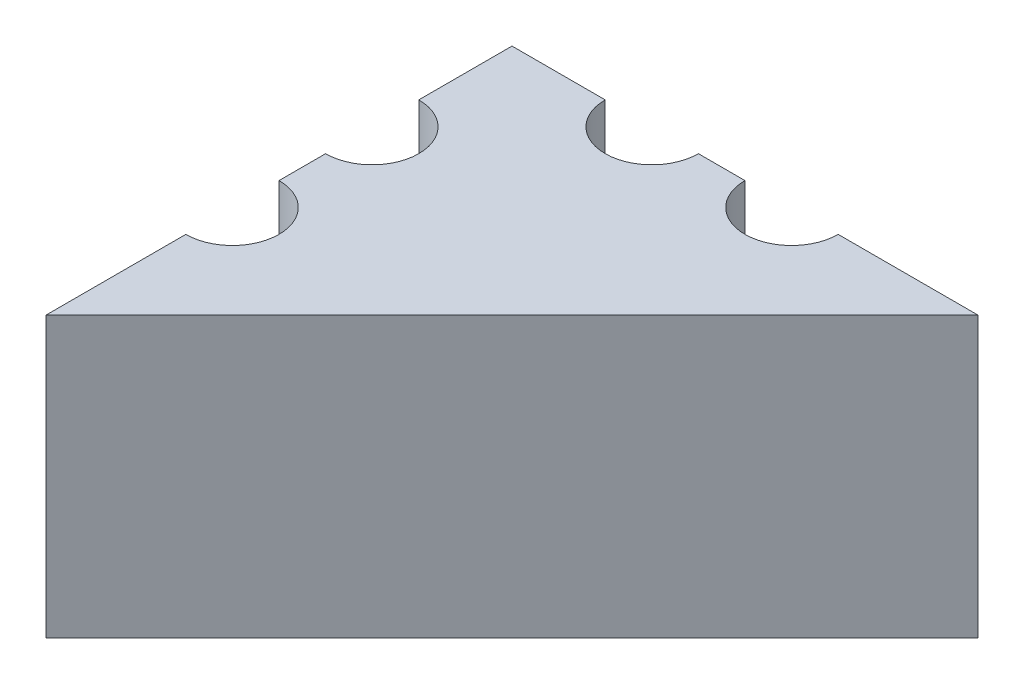
ISO-10303-21;
HEADER;
FILE_DESCRIPTION(('STEP AP214'),'2;1');
FILE_NAME('part.step','',(''),(''),'','','');
FILE_SCHEMA(('AUTOMOTIVE_DESIGN { 1 0 10303 214 1 1 1 1 }'));
ENDSEC;
DATA;
#1=APPLICATION_CONTEXT('core data for automotive mechanical design processes');
#2=APPLICATION_PROTOCOL_DEFINITION('international standard','automotive_design',2000,#1);
#3=PRODUCT_CONTEXT('',#1,'mechanical');
#4=PRODUCT('Part','Part','',(#3));
#5=PRODUCT_RELATED_PRODUCT_CATEGORY('part','',(#4));
#6=PRODUCT_DEFINITION_FORMATION('','',#4);
#7=PRODUCT_DEFINITION_CONTEXT('part definition',#1,'design');
#8=PRODUCT_DEFINITION('design','',#6,#7);
#9=PRODUCT_DEFINITION_SHAPE('','',#8);
#10=(LENGTH_UNIT() NAMED_UNIT(*) SI_UNIT(.MILLI.,.METRE.));
#11=(NAMED_UNIT(*) PLANE_ANGLE_UNIT() SI_UNIT($,.RADIAN.));
#12=(NAMED_UNIT(*) SI_UNIT($,.STERADIAN.) SOLID_ANGLE_UNIT());
#13=UNCERTAINTY_MEASURE_WITH_UNIT(LENGTH_MEASURE(1.E-05),#10,'distance_accuracy_value','');
#14=(GEOMETRIC_REPRESENTATION_CONTEXT(3) GLOBAL_UNCERTAINTY_ASSIGNED_CONTEXT((#13)) GLOBAL_UNIT_ASSIGNED_CONTEXT((#10,
#11,#12)) REPRESENTATION_CONTEXT('',''));
#15=CARTESIAN_POINT('',(0.,0.,0.));
#16=DIRECTION('',(0.,0.,1.));
#17=DIRECTION('',(1.,0.,0.));
#18=AXIS2_PLACEMENT_3D('',#15,#16,#17);
#19=CARTESIAN_POINT('',(0.,6.,0.));
#20=DIRECTION('',(0.,0.,1.));
#21=DIRECTION('',(1.,0.,0.));
#22=AXIS2_PLACEMENT_3D('',#19,#20,#21);
#23=PLANE('',#22);
#24=DIRECTION('',(-1.,0.,0.));
#25=VECTOR('',#24,1.);
#26=CARTESIAN_POINT('',(0.,0.,0.));
#27=LINE('',#26,#25);
#28=CARTESIAN_POINT('',(10.,0.,0.));
#29=VERTEX_POINT('',#28);
#30=CARTESIAN_POINT('',(7.,0.,0.));
#31=VERTEX_POINT('',#30);
#32=EDGE_CURVE('E130',#29,#31,#27,.T.);
#33=ORIENTED_EDGE('',*,*,#32,.T.);
#34=DIRECTION('',(0.,1.,0.));
#35=VECTOR('',#34,1.);
#36=CARTESIAN_POINT('',(7.,0.,0.));
#37=LINE('',#36,#35);
#38=CARTESIAN_POINT('',(7.,6.,0.));
#39=VERTEX_POINT('',#38);
#40=EDGE_CURVE('E49',#31,#39,#37,.T.);
#41=ORIENTED_EDGE('',*,*,#40,.T.);
#42=DIRECTION('',(-1.,0.,0.));
#43=VECTOR('',#42,1.);
#44=CARTESIAN_POINT('',(0.,6.,0.));
#45=LINE('',#44,#43);
#46=CARTESIAN_POINT('',(10.,6.,0.));
#47=VERTEX_POINT('',#46);
#48=EDGE_CURVE('E142',#47,#39,#45,.T.);
#49=ORIENTED_EDGE('',*,*,#48,.F.);
#50=DIRECTION('',(0.,-1.,0.));
#51=VECTOR('',#50,1.);
#52=CARTESIAN_POINT('',(10.,6.,0.));
#53=LINE('',#52,#51);
#54=EDGE_CURVE('E141',#47,#29,#53,.T.);
#55=ORIENTED_EDGE('',*,*,#54,.T.);
#56=EDGE_LOOP('',(#33,#41,#49,#55));
#57=FACE_BOUND('',#56,.T.);
#58=ADVANCED_FACE('F35',(#57),#23,.F.);
#59=CARTESIAN_POINT('',(5.,6.,0.));
#60=VERTEX_POINT('',#59);
#61=CARTESIAN_POINT('',(4.,6.,0.));
#62=VERTEX_POINT('',#61);
#63=EDGE_CURVE('E124',#60,#62,#45,.T.);
#64=ORIENTED_EDGE('',*,*,#63,.F.);
#65=DIRECTION('',(0.,1.,0.));
#66=VECTOR('',#65,1.);
#67=CARTESIAN_POINT('',(5.,0.,0.));
#68=LINE('',#67,#66);
#69=CARTESIAN_POINT('',(5.,0.,0.));
#70=VERTEX_POINT('',#69);
#71=EDGE_CURVE('E117',#60,#70,#68,.F.);
#72=ORIENTED_EDGE('',*,*,#71,.T.);
#73=CARTESIAN_POINT('',(4.,0.,0.));
#74=VERTEX_POINT('',#73);
#75=EDGE_CURVE('E57',#70,#74,#27,.T.);
#76=ORIENTED_EDGE('',*,*,#75,.T.);
#77=DIRECTION('',(0.,1.,0.));
#78=VECTOR('',#77,1.);
#79=CARTESIAN_POINT('',(4.,0.,0.));
#80=LINE('',#79,#78);
#81=EDGE_CURVE('E153',#74,#62,#80,.T.);
#82=ORIENTED_EDGE('',*,*,#81,.T.);
#83=EDGE_LOOP('',(#64,#72,#76,#82));
#84=FACE_BOUND('',#83,.T.);
#85=ADVANCED_FACE('F123',(#84),#23,.F.);
#86=CARTESIAN_POINT('',(0.,6.,10.));
#87=DIRECTION('',(1.,0.,0.));
#88=DIRECTION('',(0.,0.,-1.));
#89=AXIS2_PLACEMENT_3D('',#86,#87,#88);
#90=PLANE('',#89);
#91=DIRECTION('',(0.,0.,1.));
#92=VECTOR('',#91,1.);
#93=CARTESIAN_POINT('',(0.,0.,10.));
#94=LINE('',#93,#92);
#95=CARTESIAN_POINT('',(0.,0.,0.));
#96=VERTEX_POINT('',#95);
#97=CARTESIAN_POINT('',(0.,0.,2.));
#98=VERTEX_POINT('',#97);
#99=EDGE_CURVE('E164',#96,#98,#94,.T.);
#100=ORIENTED_EDGE('',*,*,#99,.T.);
#101=DIRECTION('',(0.,1.,0.));
#102=VECTOR('',#101,1.);
#103=CARTESIAN_POINT('',(0.,0.,2.));
#104=LINE('',#103,#102);
#105=CARTESIAN_POINT('',(0.,6.,2.));
#106=VERTEX_POINT('',#105);
#107=EDGE_CURVE('E200',#98,#106,#104,.T.);
#108=ORIENTED_EDGE('',*,*,#107,.T.);
#109=DIRECTION('',(0.,0.,1.));
#110=VECTOR('',#109,1.);
#111=CARTESIAN_POINT('',(0.,6.,10.));
#112=LINE('',#111,#110);
#113=CARTESIAN_POINT('',(0.,6.,0.));
#114=VERTEX_POINT('',#113);
#115=EDGE_CURVE('E188',#114,#106,#112,.T.);
#116=ORIENTED_EDGE('',*,*,#115,.F.);
#117=DIRECTION('',(0.,-1.,0.));
#118=VECTOR('',#117,1.);
#119=CARTESIAN_POINT('',(0.,6.,0.));
#120=LINE('',#119,#118);
#121=EDGE_CURVE('E138',#114,#96,#120,.T.);
#122=ORIENTED_EDGE('',*,*,#121,.T.);
#123=EDGE_LOOP('',(#100,#108,#116,#122));
#124=FACE_BOUND('',#123,.T.);
#125=ADVANCED_FACE('F199',(#124),#90,.F.);
#126=CARTESIAN_POINT('',(0.,6.,4.));
#127=VERTEX_POINT('',#126);
#128=CARTESIAN_POINT('',(0.,6.,5.));
#129=VERTEX_POINT('',#128);
#130=EDGE_CURVE('E192',#127,#129,#112,.T.);
#131=ORIENTED_EDGE('',*,*,#130,.F.);
#132=DIRECTION('',(0.,1.,0.));
#133=VECTOR('',#132,1.);
#134=CARTESIAN_POINT('',(0.,0.,4.));
#135=LINE('',#134,#133);
#136=CARTESIAN_POINT('',(0.,0.,4.));
#137=VERTEX_POINT('',#136);
#138=EDGE_CURVE('E203',#127,#137,#135,.F.);
#139=ORIENTED_EDGE('',*,*,#138,.T.);
#140=CARTESIAN_POINT('',(0.,0.,5.));
#141=VERTEX_POINT('',#140);
#142=EDGE_CURVE('E169',#137,#141,#94,.T.);
#143=ORIENTED_EDGE('',*,*,#142,.T.);
#144=DIRECTION('',(0.,1.,0.));
#145=VECTOR('',#144,1.);
#146=CARTESIAN_POINT('',(0.,0.,5.));
#147=LINE('',#146,#145);
#148=EDGE_CURVE('E172',#141,#129,#147,.T.);
#149=ORIENTED_EDGE('',*,*,#148,.T.);
#150=EDGE_LOOP('',(#131,#139,#143,#149));
#151=FACE_BOUND('',#150,.T.);
#152=ADVANCED_FACE('F217',(#151),#90,.F.);
#153=CARTESIAN_POINT('',(0.,6.,7.));
#154=VERTEX_POINT('',#153);
#155=CARTESIAN_POINT('',(0.,6.,10.));
#156=VERTEX_POINT('',#155);
#157=EDGE_CURVE('E133',#154,#156,#112,.T.);
#158=ORIENTED_EDGE('',*,*,#157,.F.);
#159=DIRECTION('',(0.,1.,0.));
#160=VECTOR('',#159,1.);
#161=CARTESIAN_POINT('',(0.,0.,7.));
#162=LINE('',#161,#160);
#163=CARTESIAN_POINT('',(0.,0.,7.));
#164=VERTEX_POINT('',#163);
#165=EDGE_CURVE('E179',#154,#164,#162,.F.);
#166=ORIENTED_EDGE('',*,*,#165,.T.);
#167=CARTESIAN_POINT('',(0.,0.,10.));
#168=VERTEX_POINT('',#167);
#169=EDGE_CURVE('E170',#164,#168,#94,.T.);
#170=ORIENTED_EDGE('',*,*,#169,.T.);
#171=DIRECTION('',(0.,-1.,0.));
#172=VECTOR('',#171,1.);
#173=CARTESIAN_POINT('',(0.,6.,10.));
#174=LINE('',#173,#172);
#175=EDGE_CURVE('E145',#156,#168,#174,.T.);
#176=ORIENTED_EDGE('',*,*,#175,.F.);
#177=EDGE_LOOP('',(#158,#166,#170,#176));
#178=FACE_BOUND('',#177,.T.);
#179=ADVANCED_FACE('F37',(#178),#90,.F.);
#180=CARTESIAN_POINT('',(10.,6.,0.));
#181=DIRECTION('',(-0.707106781186547,0.,-0.707106781186547));
#182=DIRECTION('',(-0.707106781186548,0.,0.707106781186548));
#183=AXIS2_PLACEMENT_3D('',#180,#181,#182);
#184=PLANE('',#183);
#185=DIRECTION('',(0.707106781186548,0.,-0.707106781186548));
#186=VECTOR('',#185,1.);
#187=CARTESIAN_POINT('',(10.,0.,0.));
#188=LINE('',#187,#186);
#189=EDGE_CURVE('E134',#168,#29,#188,.T.);
#190=ORIENTED_EDGE('',*,*,#189,.T.);
#191=ORIENTED_EDGE('',*,*,#54,.F.);
#192=DIRECTION('',(0.707106781186548,0.,-0.707106781186548));
#193=VECTOR('',#192,1.);
#194=CARTESIAN_POINT('',(10.,6.,0.));
#195=LINE('',#194,#193);
#196=EDGE_CURVE('E191',#156,#47,#195,.T.);
#197=ORIENTED_EDGE('',*,*,#196,.F.);
#198=ORIENTED_EDGE('',*,*,#175,.T.);
#199=EDGE_LOOP('',(#190,#191,#197,#198));
#200=FACE_BOUND('',#199,.T.);
#201=ADVANCED_FACE('F227',(#200),#184,.F.);
#202=CARTESIAN_POINT('',(2.,6.,0.));
#203=VERTEX_POINT('',#202);
#204=EDGE_CURVE('E158',#203,#114,#45,.T.);
#205=ORIENTED_EDGE('',*,*,#204,.F.);
#206=DIRECTION('',(0.,1.,0.));
#207=VECTOR('',#206,1.);
#208=CARTESIAN_POINT('',(2.,0.,0.));
#209=LINE('',#208,#207);
#210=CARTESIAN_POINT('',(2.,0.,0.));
#211=VERTEX_POINT('',#210);
#212=EDGE_CURVE('E151',#203,#211,#209,.F.);
#213=ORIENTED_EDGE('',*,*,#212,.T.);
#214=EDGE_CURVE('E131',#211,#96,#27,.T.);
#215=ORIENTED_EDGE('',*,*,#214,.T.);
#216=ORIENTED_EDGE('',*,*,#121,.F.);
#217=EDGE_LOOP('',(#205,#213,#215,#216));
#218=FACE_BOUND('',#217,.T.);
#219=ADVANCED_FACE('F156',(#218),#23,.F.);
#220=CARTESIAN_POINT('',(0.,6.,0.));
#221=DIRECTION('',(0.,-1.,0.));
#222=DIRECTION('',(0.,0.,-1.));
#223=AXIS2_PLACEMENT_3D('',#220,#221,#222);
#224=PLANE('',#223);
#225=ORIENTED_EDGE('',*,*,#48,.T.);
#226=CARTESIAN_POINT('',(6.,6.,0.));
#227=DIRECTION('',(0.,1.,0.));
#228=DIRECTION('',(0.,0.,1.));
#229=AXIS2_PLACEMENT_3D('',#226,#227,#228);
#230=CIRCLE('',#229,1.);
#231=EDGE_CURVE('E125',#60,#39,#230,.T.);
#232=ORIENTED_EDGE('',*,*,#231,.F.);
#233=ORIENTED_EDGE('',*,*,#63,.T.);
#234=CARTESIAN_POINT('',(3.,6.,0.));
#235=DIRECTION('',(0.,1.,0.));
#236=DIRECTION('',(0.,0.,1.));
#237=AXIS2_PLACEMENT_3D('',#234,#235,#236);
#238=CIRCLE('',#237,1.);
#239=EDGE_CURVE('E159',#203,#62,#238,.T.);
#240=ORIENTED_EDGE('',*,*,#239,.F.);
#241=ORIENTED_EDGE('',*,*,#204,.T.);
#242=ORIENTED_EDGE('',*,*,#115,.T.);
#243=CARTESIAN_POINT('',(0.,6.,3.));
#244=DIRECTION('',(0.,1.,0.));
#245=DIRECTION('',(0.,0.,1.));
#246=AXIS2_PLACEMENT_3D('',#243,#244,#245);
#247=CIRCLE('',#246,1.);
#248=EDGE_CURVE('E216',#127,#106,#247,.T.);
#249=ORIENTED_EDGE('',*,*,#248,.F.);
#250=ORIENTED_EDGE('',*,*,#130,.T.);
#251=CARTESIAN_POINT('',(0.,6.,6.));
#252=DIRECTION('',(0.,1.,0.));
#253=DIRECTION('',(0.,0.,1.));
#254=AXIS2_PLACEMENT_3D('',#251,#252,#253);
#255=CIRCLE('',#254,1.);
#256=EDGE_CURVE('E202',#154,#129,#255,.T.);
#257=ORIENTED_EDGE('',*,*,#256,.F.);
#258=ORIENTED_EDGE('',*,*,#157,.T.);
#259=ORIENTED_EDGE('',*,*,#196,.T.);
#260=EDGE_LOOP('',(#225,#232,#233,#240,#241,#242,#249,#250,#257,#258,#259));
#261=FACE_BOUND('',#260,.T.);
#262=ADVANCED_FACE('F196',(#261),#224,.F.);
#263=CARTESIAN_POINT('',(0.,0.,0.));
#264=DIRECTION('',(0.,-1.,0.));
#265=DIRECTION('',(0.,0.,-1.));
#266=AXIS2_PLACEMENT_3D('',#263,#264,#265);
#267=PLANE('',#266);
#268=CARTESIAN_POINT('',(6.,0.,0.));
#269=DIRECTION('',(0.,-1.,0.));
#270=DIRECTION('',(0.,0.,-1.));
#271=AXIS2_PLACEMENT_3D('',#268,#269,#270);
#272=CIRCLE('',#271,1.);
#273=EDGE_CURVE('E11',#31,#70,#272,.T.);
#274=ORIENTED_EDGE('',*,*,#273,.F.);
#275=ORIENTED_EDGE('',*,*,#32,.F.);
#276=ORIENTED_EDGE('',*,*,#189,.F.);
#277=ORIENTED_EDGE('',*,*,#169,.F.);
#278=CARTESIAN_POINT('',(0.,0.,6.));
#279=DIRECTION('',(0.,1.,0.));
#280=DIRECTION('',(0.,0.,1.));
#281=AXIS2_PLACEMENT_3D('',#278,#279,#280);
#282=CIRCLE('',#281,1.);
#283=EDGE_CURVE('E184',#164,#141,#282,.T.);
#284=ORIENTED_EDGE('',*,*,#283,.T.);
#285=ORIENTED_EDGE('',*,*,#142,.F.);
#286=CARTESIAN_POINT('',(0.,0.,3.));
#287=DIRECTION('',(0.,1.,0.));
#288=DIRECTION('',(0.,0.,1.));
#289=AXIS2_PLACEMENT_3D('',#286,#287,#288);
#290=CIRCLE('',#289,1.);
#291=EDGE_CURVE('E166',#137,#98,#290,.T.);
#292=ORIENTED_EDGE('',*,*,#291,.T.);
#293=ORIENTED_EDGE('',*,*,#99,.F.);
#294=ORIENTED_EDGE('',*,*,#214,.F.);
#295=CARTESIAN_POINT('',(3.,0.,0.));
#296=DIRECTION('',(0.,-1.,0.));
#297=DIRECTION('',(0.,0.,-1.));
#298=AXIS2_PLACEMENT_3D('',#295,#296,#297);
#299=CIRCLE('',#298,1.);
#300=EDGE_CURVE('E43',#74,#211,#299,.T.);
#301=ORIENTED_EDGE('',*,*,#300,.F.);
#302=ORIENTED_EDGE('',*,*,#75,.F.);
#303=EDGE_LOOP('',(#274,#275,#276,#277,#284,#285,#292,#293,#294,#301,#302));
#304=FACE_BOUND('',#303,.T.);
#305=ADVANCED_FACE('F128',(#304),#267,.T.);
#306=CARTESIAN_POINT('',(0.,0.,6.));
#307=DIRECTION('',(0.,1.,0.));
#308=DIRECTION('',(0.,0.,1.));
#309=AXIS2_PLACEMENT_3D('',#306,#307,#308);
#310=CYLINDRICAL_SURFACE('',#309,1.);
#311=ORIENTED_EDGE('',*,*,#283,.F.);
#312=ORIENTED_EDGE('',*,*,#165,.F.);
#313=ORIENTED_EDGE('',*,*,#256,.T.);
#314=ORIENTED_EDGE('',*,*,#148,.F.);
#315=EDGE_LOOP('',(#311,#312,#313,#314));
#316=FACE_BOUND('',#315,.T.);
#317=ADVANCED_FACE('F212',(#316),#310,.F.);
#318=CARTESIAN_POINT('',(0.,0.,3.));
#319=DIRECTION('',(0.,1.,0.));
#320=DIRECTION('',(0.,0.,1.));
#321=AXIS2_PLACEMENT_3D('',#318,#319,#320);
#322=CYLINDRICAL_SURFACE('',#321,1.);
#323=ORIENTED_EDGE('',*,*,#291,.F.);
#324=ORIENTED_EDGE('',*,*,#138,.F.);
#325=ORIENTED_EDGE('',*,*,#248,.T.);
#326=ORIENTED_EDGE('',*,*,#107,.F.);
#327=EDGE_LOOP('',(#323,#324,#325,#326));
#328=FACE_BOUND('',#327,.T.);
#329=ADVANCED_FACE('F218',(#328),#322,.F.);
#330=CARTESIAN_POINT('',(3.,0.,0.));
#331=DIRECTION('',(0.,1.,0.));
#332=DIRECTION('',(0.,0.,1.));
#333=AXIS2_PLACEMENT_3D('',#330,#331,#332);
#334=CYLINDRICAL_SURFACE('',#333,1.);
#335=ORIENTED_EDGE('',*,*,#300,.T.);
#336=ORIENTED_EDGE('',*,*,#212,.F.);
#337=ORIENTED_EDGE('',*,*,#239,.T.);
#338=ORIENTED_EDGE('',*,*,#81,.F.);
#339=EDGE_LOOP('',(#335,#336,#337,#338));
#340=FACE_BOUND('',#339,.T.);
#341=ADVANCED_FACE('F149',(#340),#334,.F.);
#342=CARTESIAN_POINT('',(6.,0.,0.));
#343=DIRECTION('',(0.,1.,0.));
#344=DIRECTION('',(0.,0.,1.));
#345=AXIS2_PLACEMENT_3D('',#342,#343,#344);
#346=CYLINDRICAL_SURFACE('',#345,1.);
#347=ORIENTED_EDGE('',*,*,#273,.T.);
#348=ORIENTED_EDGE('',*,*,#71,.F.);
#349=ORIENTED_EDGE('',*,*,#231,.T.);
#350=ORIENTED_EDGE('',*,*,#40,.F.);
#351=EDGE_LOOP('',(#347,#348,#349,#350));
#352=FACE_BOUND('',#351,.T.);
#353=ADVANCED_FACE('F116',(#352),#346,.F.);
#354=CLOSED_SHELL('',(#58,#85,#125,#152,#179,#201,#219,#262,#305,#317,#329,#341,#353));
#355=MANIFOLD_SOLID_BREP('B2',#354);
#356=ADVANCED_BREP_SHAPE_REPRESENTATION('',(#18,#355),#14);
#357=SHAPE_DEFINITION_REPRESENTATION(#9,#356);
ENDSEC;
END-ISO-10303-21;
